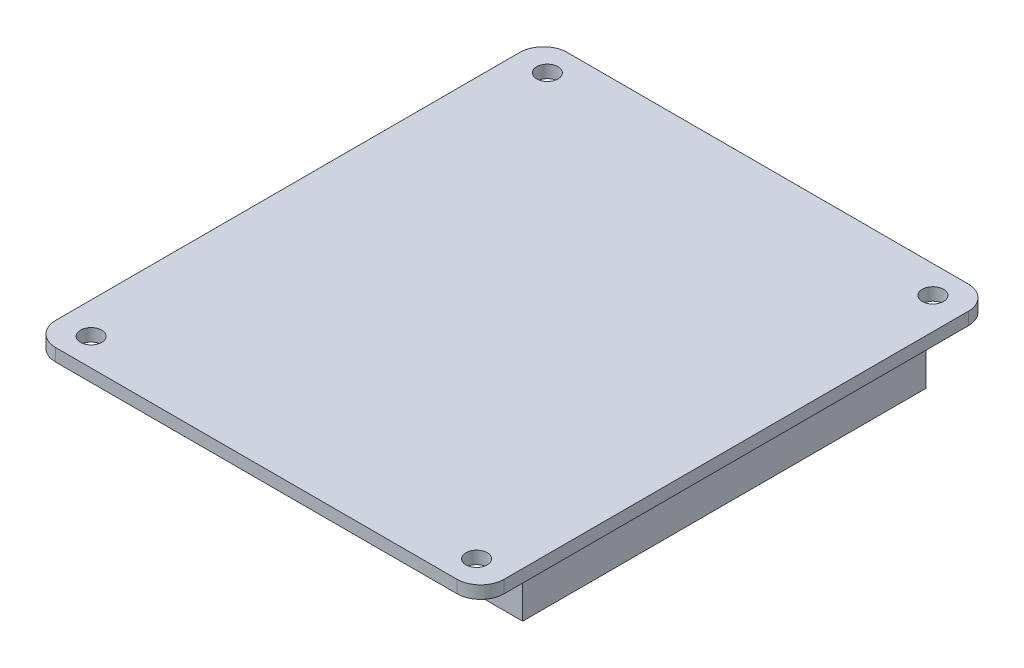
ISO-10303-21;
HEADER;
FILE_DESCRIPTION(('STEP AP214'),'2;1');
FILE_NAME('part.step','',(''),(''),'','','');
FILE_SCHEMA(('AUTOMOTIVE_DESIGN { 1 0 10303 214 1 1 1 1 }'));
ENDSEC;
DATA;
#1=APPLICATION_CONTEXT('core data for automotive mechanical design processes');
#2=APPLICATION_PROTOCOL_DEFINITION('international standard','automotive_design',2000,#1);
#3=PRODUCT_CONTEXT('',#1,'mechanical');
#4=PRODUCT('Part','Part','',(#3));
#5=PRODUCT_RELATED_PRODUCT_CATEGORY('part','',(#4));
#6=PRODUCT_DEFINITION_FORMATION('','',#4);
#7=PRODUCT_DEFINITION_CONTEXT('part definition',#1,'design');
#8=PRODUCT_DEFINITION('design','',#6,#7);
#9=PRODUCT_DEFINITION_SHAPE('','',#8);
#10=(LENGTH_UNIT() NAMED_UNIT(*) SI_UNIT(.MILLI.,.METRE.));
#11=(NAMED_UNIT(*) PLANE_ANGLE_UNIT() SI_UNIT($,.RADIAN.));
#12=(NAMED_UNIT(*) SI_UNIT($,.STERADIAN.) SOLID_ANGLE_UNIT());
#13=UNCERTAINTY_MEASURE_WITH_UNIT(LENGTH_MEASURE(1.E-05),#10,'distance_accuracy_value','');
#14=(GEOMETRIC_REPRESENTATION_CONTEXT(3) GLOBAL_UNCERTAINTY_ASSIGNED_CONTEXT((#13)) GLOBAL_UNIT_ASSIGNED_CONTEXT((#10,
#11,#12)) REPRESENTATION_CONTEXT('',''));
#15=CARTESIAN_POINT('',(0.,0.,0.));
#16=DIRECTION('',(0.,0.,1.));
#17=DIRECTION('',(1.,0.,0.));
#18=AXIS2_PLACEMENT_3D('',#15,#16,#17);
#19=CARTESIAN_POINT('',(3.,1.6,-3.));
#20=DIRECTION('',(0.,-1.,0.));
#21=DIRECTION('',(0.,0.,-1.));
#22=AXIS2_PLACEMENT_3D('',#19,#20,#21);
#23=CYLINDRICAL_SURFACE('',#22,3.);
#24=CARTESIAN_POINT('',(3.,0.,-3.));
#25=DIRECTION('',(0.,1.,0.));
#26=DIRECTION('',(0.,0.,-1.));
#27=AXIS2_PLACEMENT_3D('',#24,#25,#26);
#28=CIRCLE('',#27,3.);
#29=CARTESIAN_POINT('',(0.,0.,-3.00000000000002));
#30=VERTEX_POINT('',#29);
#31=CARTESIAN_POINT('',(3.00000000000002,0.,0.));
#32=VERTEX_POINT('',#31);
#33=EDGE_CURVE('E173',#30,#32,#28,.T.);
#34=ORIENTED_EDGE('',*,*,#33,.T.);
#35=DIRECTION('',(0.,-1.,0.));
#36=VECTOR('',#35,1.);
#37=CARTESIAN_POINT('',(3.00000000000002,1.6,0.));
#38=LINE('',#37,#36);
#39=CARTESIAN_POINT('',(3.00000000000002,1.6,0.));
#40=VERTEX_POINT('',#39);
#41=EDGE_CURVE('E11',#40,#32,#38,.T.);
#42=ORIENTED_EDGE('',*,*,#41,.F.);
#43=CARTESIAN_POINT('',(3.,1.6,-3.));
#44=DIRECTION('',(0.,1.,0.));
#45=DIRECTION('',(0.,0.,-1.));
#46=AXIS2_PLACEMENT_3D('',#43,#44,#45);
#47=CIRCLE('',#46,3.);
#48=CARTESIAN_POINT('',(0.,1.6,-3.00000000000002));
#49=VERTEX_POINT('',#48);
#50=EDGE_CURVE('E177',#49,#40,#47,.T.);
#51=ORIENTED_EDGE('',*,*,#50,.F.);
#52=DIRECTION('',(0.,-1.,0.));
#53=VECTOR('',#52,1.);
#54=CARTESIAN_POINT('',(0.,1.6,-3.00000000000002));
#55=LINE('',#54,#53);
#56=EDGE_CURVE('E198',#49,#30,#55,.T.);
#57=ORIENTED_EDGE('',*,*,#56,.T.);
#58=EDGE_LOOP('',(#34,#42,#51,#57));
#59=FACE_BOUND('',#58,.T.);
#60=ADVANCED_FACE('F37',(#59),#23,.T.);
#61=CARTESIAN_POINT('',(3.00000000000002,1.6,0.));
#62=DIRECTION('',(0.,0.,-1.));
#63=DIRECTION('',(-1.,0.,0.));
#64=AXIS2_PLACEMENT_3D('',#61,#62,#63);
#65=PLANE('',#64);
#66=DIRECTION('',(1.,0.,0.));
#67=VECTOR('',#66,1.);
#68=CARTESIAN_POINT('',(3.00000000000002,0.,0.));
#69=LINE('',#68,#67);
#70=CARTESIAN_POINT('',(54.,0.,0.));
#71=VERTEX_POINT('',#70);
#72=EDGE_CURVE('E200',#32,#71,#69,.T.);
#73=ORIENTED_EDGE('',*,*,#72,.T.);
#74=DIRECTION('',(0.,-1.,0.));
#75=VECTOR('',#74,1.);
#76=CARTESIAN_POINT('',(54.,1.6,0.));
#77=LINE('',#76,#75);
#78=CARTESIAN_POINT('',(54.,1.6,0.));
#79=VERTEX_POINT('',#78);
#80=EDGE_CURVE('E50',#79,#71,#77,.T.);
#81=ORIENTED_EDGE('',*,*,#80,.F.);
#82=DIRECTION('',(1.,0.,0.));
#83=VECTOR('',#82,1.);
#84=CARTESIAN_POINT('',(3.00000000000002,1.6,0.));
#85=LINE('',#84,#83);
#86=EDGE_CURVE('E182',#40,#79,#85,.T.);
#87=ORIENTED_EDGE('',*,*,#86,.F.);
#88=ORIENTED_EDGE('',*,*,#41,.T.);
#89=EDGE_LOOP('',(#73,#81,#87,#88));
#90=FACE_BOUND('',#89,.T.);
#91=ADVANCED_FACE('F258',(#90),#65,.F.);
#92=CARTESIAN_POINT('',(54.,1.6,-3.));
#93=DIRECTION('',(0.,-1.,0.));
#94=DIRECTION('',(0.,0.,-1.));
#95=AXIS2_PLACEMENT_3D('',#92,#93,#94);
#96=CYLINDRICAL_SURFACE('',#95,3.);
#97=CARTESIAN_POINT('',(54.,0.,-3.));
#98=DIRECTION('',(0.,1.,0.));
#99=DIRECTION('',(0.,0.,1.));
#100=AXIS2_PLACEMENT_3D('',#97,#98,#99);
#101=CIRCLE('',#100,3.);
#102=CARTESIAN_POINT('',(57.,0.,-3.00000000000002));
#103=VERTEX_POINT('',#102);
#104=EDGE_CURVE('E203',#71,#103,#101,.T.);
#105=ORIENTED_EDGE('',*,*,#104,.T.);
#106=DIRECTION('',(0.,-1.,0.));
#107=VECTOR('',#106,1.);
#108=CARTESIAN_POINT('',(57.,1.6,-3.00000000000002));
#109=LINE('',#108,#107);
#110=CARTESIAN_POINT('',(57.,1.6,-3.00000000000002));
#111=VERTEX_POINT('',#110);
#112=EDGE_CURVE('E227',#111,#103,#109,.T.);
#113=ORIENTED_EDGE('',*,*,#112,.F.);
#114=CARTESIAN_POINT('',(54.,1.6,-3.));
#115=DIRECTION('',(0.,1.,0.));
#116=DIRECTION('',(0.,0.,1.));
#117=AXIS2_PLACEMENT_3D('',#114,#115,#116);
#118=CIRCLE('',#117,3.);
#119=EDGE_CURVE('E184',#79,#111,#118,.T.);
#120=ORIENTED_EDGE('',*,*,#119,.F.);
#121=ORIENTED_EDGE('',*,*,#80,.T.);
#122=EDGE_LOOP('',(#105,#113,#120,#121));
#123=FACE_BOUND('',#122,.T.);
#124=ADVANCED_FACE('F232',(#123),#96,.T.);
#125=CARTESIAN_POINT('',(57.,1.6,-3.00000000000002));
#126=DIRECTION('',(-1.,0.,0.));
#127=DIRECTION('',(0.,0.,1.));
#128=AXIS2_PLACEMENT_3D('',#125,#126,#127);
#129=PLANE('',#128);
#130=DIRECTION('',(0.,0.,-1.));
#131=VECTOR('',#130,1.);
#132=CARTESIAN_POINT('',(57.,0.,-3.00000000000002));
#133=LINE('',#132,#131);
#134=CARTESIAN_POINT('',(57.,0.,-62.));
#135=VERTEX_POINT('',#134);
#136=EDGE_CURVE('E201',#103,#135,#133,.T.);
#137=ORIENTED_EDGE('',*,*,#136,.T.);
#138=DIRECTION('',(0.,-1.,0.));
#139=VECTOR('',#138,1.);
#140=CARTESIAN_POINT('',(57.,1.6,-62.));
#141=LINE('',#140,#139);
#142=CARTESIAN_POINT('',(57.,1.6,-62.));
#143=VERTEX_POINT('',#142);
#144=EDGE_CURVE('E224',#143,#135,#141,.T.);
#145=ORIENTED_EDGE('',*,*,#144,.F.);
#146=DIRECTION('',(0.,0.,-1.));
#147=VECTOR('',#146,1.);
#148=CARTESIAN_POINT('',(57.,1.6,-3.00000000000002));
#149=LINE('',#148,#147);
#150=EDGE_CURVE('E187',#111,#143,#149,.T.);
#151=ORIENTED_EDGE('',*,*,#150,.F.);
#152=ORIENTED_EDGE('',*,*,#112,.T.);
#153=EDGE_LOOP('',(#137,#145,#151,#152));
#154=FACE_BOUND('',#153,.T.);
#155=ADVANCED_FACE('F241',(#154),#129,.F.);
#156=CARTESIAN_POINT('',(54.,1.6,-62.));
#157=DIRECTION('',(0.,-1.,0.));
#158=DIRECTION('',(0.,0.,-1.));
#159=AXIS2_PLACEMENT_3D('',#156,#157,#158);
#160=CYLINDRICAL_SURFACE('',#159,3.);
#161=CARTESIAN_POINT('',(54.,0.,-62.));
#162=DIRECTION('',(0.,1.,0.));
#163=DIRECTION('',(0.,0.,-1.));
#164=AXIS2_PLACEMENT_3D('',#161,#162,#163);
#165=CIRCLE('',#164,3.);
#166=CARTESIAN_POINT('',(54.,0.,-65.));
#167=VERTEX_POINT('',#166);
#168=EDGE_CURVE('E202',#135,#167,#165,.T.);
#169=ORIENTED_EDGE('',*,*,#168,.T.);
#170=DIRECTION('',(0.,-1.,0.));
#171=VECTOR('',#170,1.);
#172=CARTESIAN_POINT('',(54.,1.6,-65.));
#173=LINE('',#172,#171);
#174=CARTESIAN_POINT('',(54.,1.6,-65.));
#175=VERTEX_POINT('',#174);
#176=EDGE_CURVE('E219',#175,#167,#173,.T.);
#177=ORIENTED_EDGE('',*,*,#176,.F.);
#178=CARTESIAN_POINT('',(54.,1.6,-62.));
#179=DIRECTION('',(0.,1.,0.));
#180=DIRECTION('',(0.,0.,-1.));
#181=AXIS2_PLACEMENT_3D('',#178,#179,#180);
#182=CIRCLE('',#181,3.);
#183=EDGE_CURVE('E189',#143,#175,#182,.T.);
#184=ORIENTED_EDGE('',*,*,#183,.F.);
#185=ORIENTED_EDGE('',*,*,#144,.T.);
#186=EDGE_LOOP('',(#169,#177,#184,#185));
#187=FACE_BOUND('',#186,.T.);
#188=ADVANCED_FACE('F250',(#187),#160,.T.);
#189=CARTESIAN_POINT('',(3.00000000000002,1.6,-65.));
#190=DIRECTION('',(0.,0.,1.));
#191=DIRECTION('',(1.,0.,0.));
#192=AXIS2_PLACEMENT_3D('',#189,#190,#191);
#193=PLANE('',#192);
#194=DIRECTION('',(-1.,0.,0.));
#195=VECTOR('',#194,1.);
#196=CARTESIAN_POINT('',(3.00000000000002,0.,-65.));
#197=LINE('',#196,#195);
#198=CARTESIAN_POINT('',(3.00000000000002,0.,-65.));
#199=VERTEX_POINT('',#198);
#200=EDGE_CURVE('E210',#167,#199,#197,.T.);
#201=ORIENTED_EDGE('',*,*,#200,.T.);
#202=DIRECTION('',(0.,-1.,0.));
#203=VECTOR('',#202,1.);
#204=CARTESIAN_POINT('',(3.00000000000002,1.6,-65.));
#205=LINE('',#204,#203);
#206=CARTESIAN_POINT('',(3.00000000000002,1.6,-65.));
#207=VERTEX_POINT('',#206);
#208=EDGE_CURVE('E220',#207,#199,#205,.T.);
#209=ORIENTED_EDGE('',*,*,#208,.F.);
#210=DIRECTION('',(-1.,0.,0.));
#211=VECTOR('',#210,1.);
#212=CARTESIAN_POINT('',(3.00000000000002,1.6,-65.));
#213=LINE('',#212,#211);
#214=EDGE_CURVE('E188',#175,#207,#213,.T.);
#215=ORIENTED_EDGE('',*,*,#214,.F.);
#216=ORIENTED_EDGE('',*,*,#176,.T.);
#217=EDGE_LOOP('',(#201,#209,#215,#216));
#218=FACE_BOUND('',#217,.T.);
#219=ADVANCED_FACE('F267',(#218),#193,.F.);
#220=CARTESIAN_POINT('',(3.,1.6,-62.));
#221=DIRECTION('',(0.,-1.,0.));
#222=DIRECTION('',(0.,0.,-1.));
#223=AXIS2_PLACEMENT_3D('',#220,#221,#222);
#224=CYLINDRICAL_SURFACE('',#223,3.);
#225=CARTESIAN_POINT('',(3.,0.,-62.));
#226=DIRECTION('',(0.,1.,0.));
#227=DIRECTION('',(0.,0.,-1.));
#228=AXIS2_PLACEMENT_3D('',#225,#226,#227);
#229=CIRCLE('',#228,3.);
#230=CARTESIAN_POINT('',(0.,0.,-62.));
#231=VERTEX_POINT('',#230);
#232=EDGE_CURVE('E207',#199,#231,#229,.T.);
#233=ORIENTED_EDGE('',*,*,#232,.T.);
#234=DIRECTION('',(0.,-1.,0.));
#235=VECTOR('',#234,1.);
#236=CARTESIAN_POINT('',(0.,1.6,-62.));
#237=LINE('',#236,#235);
#238=CARTESIAN_POINT('',(0.,1.6,-62.));
#239=VERTEX_POINT('',#238);
#240=EDGE_CURVE('E212',#239,#231,#237,.T.);
#241=ORIENTED_EDGE('',*,*,#240,.F.);
#242=CARTESIAN_POINT('',(3.,1.6,-62.));
#243=DIRECTION('',(0.,1.,0.));
#244=DIRECTION('',(0.,0.,-1.));
#245=AXIS2_PLACEMENT_3D('',#242,#243,#244);
#246=CIRCLE('',#245,3.);
#247=EDGE_CURVE('E191',#207,#239,#246,.T.);
#248=ORIENTED_EDGE('',*,*,#247,.F.);
#249=ORIENTED_EDGE('',*,*,#208,.T.);
#250=EDGE_LOOP('',(#233,#241,#248,#249));
#251=FACE_BOUND('',#250,.T.);
#252=ADVANCED_FACE('F270',(#251),#224,.T.);
#253=CARTESIAN_POINT('',(0.,1.6,-3.00000000000002));
#254=DIRECTION('',(1.,0.,0.));
#255=DIRECTION('',(0.,0.,-1.));
#256=AXIS2_PLACEMENT_3D('',#253,#254,#255);
#257=PLANE('',#256);
#258=DIRECTION('',(0.,0.,1.));
#259=VECTOR('',#258,1.);
#260=CARTESIAN_POINT('',(0.,0.,-3.00000000000002));
#261=LINE('',#260,#259);
#262=EDGE_CURVE('E185',#231,#30,#261,.T.);
#263=ORIENTED_EDGE('',*,*,#262,.T.);
#264=ORIENTED_EDGE('',*,*,#56,.F.);
#265=DIRECTION('',(0.,0.,1.));
#266=VECTOR('',#265,1.);
#267=CARTESIAN_POINT('',(0.,1.6,-3.00000000000002));
#268=LINE('',#267,#266);
#269=EDGE_CURVE('E193',#239,#49,#268,.T.);
#270=ORIENTED_EDGE('',*,*,#269,.F.);
#271=ORIENTED_EDGE('',*,*,#240,.T.);
#272=EDGE_LOOP('',(#263,#264,#270,#271));
#273=FACE_BOUND('',#272,.T.);
#274=ADVANCED_FACE('F265',(#273),#257,.F.);
#275=CARTESIAN_POINT('',(3.,1.6,-3.));
#276=DIRECTION('',(0.,-1.,0.));
#277=DIRECTION('',(0.,0.,-1.));
#278=AXIS2_PLACEMENT_3D('',#275,#276,#277);
#279=PLANE('',#278);
#280=CARTESIAN_POINT('',(4.00000000000001,1.6,-3.49999999999999));
#281=DIRECTION('',(0.,1.,0.));
#282=DIRECTION('',(0.,0.,1.));
#283=AXIS2_PLACEMENT_3D('',#280,#281,#282);
#284=CIRCLE('',#283,1.35);
#285=CARTESIAN_POINT('',(4.00000000000001,1.6,-2.14999999999999));
#286=VERTEX_POINT('',#285);
#287=EDGE_CURVE('E151',#286,#286,#284,.T.);
#288=ORIENTED_EDGE('',*,*,#287,.F.);
#289=EDGE_LOOP('',(#288));
#290=FACE_BOUND('',#289,.T.);
#291=CARTESIAN_POINT('',(53.,1.6,-3.49999999999999));
#292=DIRECTION('',(0.,1.,0.));
#293=DIRECTION('',(0.,0.,1.));
#294=AXIS2_PLACEMENT_3D('',#291,#292,#293);
#295=CIRCLE('',#294,1.35);
#296=CARTESIAN_POINT('',(53.,1.6,-2.14999999999999));
#297=VERTEX_POINT('',#296);
#298=EDGE_CURVE('E163',#297,#297,#295,.T.);
#299=ORIENTED_EDGE('',*,*,#298,.F.);
#300=EDGE_LOOP('',(#299));
#301=FACE_BOUND('',#300,.T.);
#302=CARTESIAN_POINT('',(53.,1.6,-61.5));
#303=DIRECTION('',(0.,1.,0.));
#304=DIRECTION('',(0.,0.,1.));
#305=AXIS2_PLACEMENT_3D('',#302,#303,#304);
#306=CIRCLE('',#305,1.35);
#307=CARTESIAN_POINT('',(53.,1.6,-60.15));
#308=VERTEX_POINT('',#307);
#309=EDGE_CURVE('E160',#308,#308,#306,.T.);
#310=ORIENTED_EDGE('',*,*,#309,.F.);
#311=EDGE_LOOP('',(#310));
#312=FACE_BOUND('',#311,.T.);
#313=CARTESIAN_POINT('',(4.,1.6,-61.5));
#314=DIRECTION('',(0.,1.,0.));
#315=DIRECTION('',(0.,0.,1.));
#316=AXIS2_PLACEMENT_3D('',#313,#314,#315);
#317=CIRCLE('',#316,1.35);
#318=CARTESIAN_POINT('',(4.,1.6,-60.15));
#319=VERTEX_POINT('',#318);
#320=EDGE_CURVE('E159',#319,#319,#317,.T.);
#321=ORIENTED_EDGE('',*,*,#320,.F.);
#322=EDGE_LOOP('',(#321));
#323=FACE_BOUND('',#322,.T.);
#324=ORIENTED_EDGE('',*,*,#50,.T.);
#325=ORIENTED_EDGE('',*,*,#86,.T.);
#326=ORIENTED_EDGE('',*,*,#119,.T.);
#327=ORIENTED_EDGE('',*,*,#150,.T.);
#328=ORIENTED_EDGE('',*,*,#183,.T.);
#329=ORIENTED_EDGE('',*,*,#214,.T.);
#330=ORIENTED_EDGE('',*,*,#247,.T.);
#331=ORIENTED_EDGE('',*,*,#269,.T.);
#332=EDGE_LOOP('',(#324,#325,#326,#327,#328,#329,#330,#331));
#333=FACE_BOUND('',#332,.T.);
#334=ADVANCED_FACE('F252',(#290,#301,#312,#323,#333),#279,.F.);
#335=CARTESIAN_POINT('',(3.,0.,-3.));
#336=DIRECTION('',(0.,-1.,0.));
#337=DIRECTION('',(0.,0.,-1.));
#338=AXIS2_PLACEMENT_3D('',#335,#336,#337);
#339=PLANE('',#338);
#340=DIRECTION('',(0.,0.,-1.));
#341=VECTOR('',#340,1.);
#342=CARTESIAN_POINT('',(50.5,0.,-58.15));
#343=LINE('',#342,#341);
#344=CARTESIAN_POINT('',(50.5,0.,-6.85));
#345=VERTEX_POINT('',#344);
#346=CARTESIAN_POINT('',(50.5,0.,-58.15));
#347=VERTEX_POINT('',#346);
#348=EDGE_CURVE('E53',#345,#347,#343,.T.);
#349=ORIENTED_EDGE('',*,*,#348,.F.);
#350=DIRECTION('',(-1.,0.,0.));
#351=VECTOR('',#350,1.);
#352=CARTESIAN_POINT('',(50.5,0.,-6.85));
#353=LINE('',#352,#351);
#354=CARTESIAN_POINT('',(55.5,0.,-6.85));
#355=VERTEX_POINT('',#354);
#356=EDGE_CURVE('E59',#355,#345,#353,.T.);
#357=ORIENTED_EDGE('',*,*,#356,.F.);
#358=DIRECTION('',(0.,0.,1.));
#359=VECTOR('',#358,1.);
#360=CARTESIAN_POINT('',(55.5,0.,-58.15));
#361=LINE('',#360,#359);
#362=CARTESIAN_POINT('',(55.5,0.,-58.15));
#363=VERTEX_POINT('',#362);
#364=EDGE_CURVE('E421',#363,#355,#361,.T.);
#365=ORIENTED_EDGE('',*,*,#364,.F.);
#366=DIRECTION('',(1.,0.,0.));
#367=VECTOR('',#366,1.);
#368=CARTESIAN_POINT('',(50.5,0.,-58.15));
#369=LINE('',#368,#367);
#370=EDGE_CURVE('E427',#347,#363,#369,.T.);
#371=ORIENTED_EDGE('',*,*,#370,.F.);
#372=EDGE_LOOP('',(#349,#357,#365,#371));
#373=FACE_BOUND('',#372,.T.);
#374=CARTESIAN_POINT('',(4.00000000000001,0.,-3.49999999999999));
#375=DIRECTION('',(0.,1.,0.));
#376=DIRECTION('',(0.,0.,1.));
#377=AXIS2_PLACEMENT_3D('',#374,#375,#376);
#378=CIRCLE('',#377,1.35);
#379=CARTESIAN_POINT('',(4.00000000000001,0.,-2.14999999999999));
#380=VERTEX_POINT('',#379);
#381=EDGE_CURVE('E146',#380,#380,#378,.T.);
#382=ORIENTED_EDGE('',*,*,#381,.T.);
#383=EDGE_LOOP('',(#382));
#384=FACE_BOUND('',#383,.T.);
#385=CARTESIAN_POINT('',(53.,0.,-3.49999999999999));
#386=DIRECTION('',(0.,1.,0.));
#387=DIRECTION('',(0.,0.,1.));
#388=AXIS2_PLACEMENT_3D('',#385,#386,#387);
#389=CIRCLE('',#388,1.35);
#390=CARTESIAN_POINT('',(53.,0.,-2.14999999999999));
#391=VERTEX_POINT('',#390);
#392=EDGE_CURVE('E170',#391,#391,#389,.T.);
#393=ORIENTED_EDGE('',*,*,#392,.T.);
#394=EDGE_LOOP('',(#393));
#395=FACE_BOUND('',#394,.T.);
#396=CARTESIAN_POINT('',(53.,0.,-61.5));
#397=DIRECTION('',(0.,1.,0.));
#398=DIRECTION('',(0.,0.,1.));
#399=AXIS2_PLACEMENT_3D('',#396,#397,#398);
#400=CIRCLE('',#399,1.35);
#401=CARTESIAN_POINT('',(53.,0.,-60.15));
#402=VERTEX_POINT('',#401);
#403=EDGE_CURVE('E161',#402,#402,#400,.T.);
#404=ORIENTED_EDGE('',*,*,#403,.T.);
#405=EDGE_LOOP('',(#404));
#406=FACE_BOUND('',#405,.T.);
#407=CARTESIAN_POINT('',(4.,0.,-61.5));
#408=DIRECTION('',(0.,1.,0.));
#409=DIRECTION('',(0.,0.,1.));
#410=AXIS2_PLACEMENT_3D('',#407,#408,#409);
#411=CIRCLE('',#410,1.35);
#412=CARTESIAN_POINT('',(4.,0.,-60.15));
#413=VERTEX_POINT('',#412);
#414=EDGE_CURVE('E175',#413,#413,#411,.T.);
#415=ORIENTED_EDGE('',*,*,#414,.T.);
#416=EDGE_LOOP('',(#415));
#417=FACE_BOUND('',#416,.T.);
#418=ORIENTED_EDGE('',*,*,#33,.F.);
#419=ORIENTED_EDGE('',*,*,#262,.F.);
#420=ORIENTED_EDGE('',*,*,#232,.F.);
#421=ORIENTED_EDGE('',*,*,#200,.F.);
#422=ORIENTED_EDGE('',*,*,#168,.F.);
#423=ORIENTED_EDGE('',*,*,#136,.F.);
#424=ORIENTED_EDGE('',*,*,#104,.F.);
#425=ORIENTED_EDGE('',*,*,#72,.F.);
#426=EDGE_LOOP('',(#418,#419,#420,#421,#422,#423,#424,#425));
#427=FACE_BOUND('',#426,.T.);
#428=ADVANCED_FACE('F239',(#373,#384,#395,#406,#417,#427),#339,.T.);
#429=CARTESIAN_POINT('',(4.,0.,-61.5));
#430=DIRECTION('',(0.,1.,0.));
#431=DIRECTION('',(0.,0.,1.));
#432=AXIS2_PLACEMENT_3D('',#429,#430,#431);
#433=CYLINDRICAL_SURFACE('',#432,1.35);
#434=ORIENTED_EDGE('',*,*,#414,.F.);
#435=EDGE_LOOP('',(#434));
#436=FACE_BOUND('',#435,.T.);
#437=ORIENTED_EDGE('',*,*,#320,.T.);
#438=EDGE_LOOP('',(#437));
#439=FACE_BOUND('',#438,.T.);
#440=ADVANCED_FACE('F333',(#436,#439),#433,.F.);
#441=CARTESIAN_POINT('',(53.,0.,-61.5));
#442=DIRECTION('',(0.,1.,0.));
#443=DIRECTION('',(0.,0.,1.));
#444=AXIS2_PLACEMENT_3D('',#441,#442,#443);
#445=CYLINDRICAL_SURFACE('',#444,1.35);
#446=ORIENTED_EDGE('',*,*,#403,.F.);
#447=EDGE_LOOP('',(#446));
#448=FACE_BOUND('',#447,.T.);
#449=ORIENTED_EDGE('',*,*,#309,.T.);
#450=EDGE_LOOP('',(#449));
#451=FACE_BOUND('',#450,.T.);
#452=ADVANCED_FACE('F344',(#448,#451),#445,.F.);
#453=CARTESIAN_POINT('',(53.,0.,-3.49999999999999));
#454=DIRECTION('',(0.,1.,0.));
#455=DIRECTION('',(0.,0.,1.));
#456=AXIS2_PLACEMENT_3D('',#453,#454,#455);
#457=CYLINDRICAL_SURFACE('',#456,1.35);
#458=ORIENTED_EDGE('',*,*,#392,.F.);
#459=EDGE_LOOP('',(#458));
#460=FACE_BOUND('',#459,.T.);
#461=ORIENTED_EDGE('',*,*,#298,.T.);
#462=EDGE_LOOP('',(#461));
#463=FACE_BOUND('',#462,.T.);
#464=ADVANCED_FACE('F353',(#460,#463),#457,.F.);
#465=CARTESIAN_POINT('',(4.00000000000001,0.,-3.49999999999999));
#466=DIRECTION('',(0.,1.,0.));
#467=DIRECTION('',(0.,0.,1.));
#468=AXIS2_PLACEMENT_3D('',#465,#466,#467);
#469=CYLINDRICAL_SURFACE('',#468,1.35);
#470=ORIENTED_EDGE('',*,*,#381,.F.);
#471=EDGE_LOOP('',(#470));
#472=FACE_BOUND('',#471,.T.);
#473=ORIENTED_EDGE('',*,*,#287,.T.);
#474=EDGE_LOOP('',(#473));
#475=FACE_BOUND('',#474,.T.);
#476=ADVANCED_FACE('F364',(#472,#475),#469,.F.);
#477=CARTESIAN_POINT('',(50.5,-5.7,-58.15));
#478=DIRECTION('',(1.,0.,0.));
#479=DIRECTION('',(0.,0.,-1.));
#480=AXIS2_PLACEMENT_3D('',#477,#478,#479);
#481=PLANE('',#480);
#482=ORIENTED_EDGE('',*,*,#348,.T.);
#483=DIRECTION('',(0.,1.,0.));
#484=VECTOR('',#483,1.);
#485=CARTESIAN_POINT('',(50.5,-5.7,-58.15));
#486=LINE('',#485,#484);
#487=CARTESIAN_POINT('',(50.5,-5.7,-58.15));
#488=VERTEX_POINT('',#487);
#489=EDGE_CURVE('E132',#488,#347,#486,.T.);
#490=ORIENTED_EDGE('',*,*,#489,.F.);
#491=DIRECTION('',(0.,0.,-1.));
#492=VECTOR('',#491,1.);
#493=CARTESIAN_POINT('',(50.5,-5.7,-58.15));
#494=LINE('',#493,#492);
#495=CARTESIAN_POINT('',(50.5,-5.7,-6.85));
#496=VERTEX_POINT('',#495);
#497=EDGE_CURVE('E136',#496,#488,#494,.T.);
#498=ORIENTED_EDGE('',*,*,#497,.F.);
#499=DIRECTION('',(0.,1.,0.));
#500=VECTOR('',#499,1.);
#501=CARTESIAN_POINT('',(50.5,-5.7,-6.85));
#502=LINE('',#501,#500);
#503=EDGE_CURVE('E423',#496,#345,#502,.T.);
#504=ORIENTED_EDGE('',*,*,#503,.T.);
#505=EDGE_LOOP('',(#482,#490,#498,#504));
#506=FACE_BOUND('',#505,.T.);
#507=ADVANCED_FACE('F150',(#506),#481,.F.);
#508=CARTESIAN_POINT('',(50.5,-5.7,-58.15));
#509=DIRECTION('',(0.,0.,1.));
#510=DIRECTION('',(1.,0.,0.));
#511=AXIS2_PLACEMENT_3D('',#508,#509,#510);
#512=PLANE('',#511);
#513=ORIENTED_EDGE('',*,*,#370,.T.);
#514=DIRECTION('',(0.,1.,0.));
#515=VECTOR('',#514,1.);
#516=CARTESIAN_POINT('',(55.5,-5.7,-58.15));
#517=LINE('',#516,#515);
#518=CARTESIAN_POINT('',(55.5,-5.7,-58.15));
#519=VERTEX_POINT('',#518);
#520=EDGE_CURVE('E134',#519,#363,#517,.T.);
#521=ORIENTED_EDGE('',*,*,#520,.F.);
#522=DIRECTION('',(1.,0.,0.));
#523=VECTOR('',#522,1.);
#524=CARTESIAN_POINT('',(50.5,-5.7,-58.15));
#525=LINE('',#524,#523);
#526=EDGE_CURVE('E127',#488,#519,#525,.T.);
#527=ORIENTED_EDGE('',*,*,#526,.F.);
#528=ORIENTED_EDGE('',*,*,#489,.T.);
#529=EDGE_LOOP('',(#513,#521,#527,#528));
#530=FACE_BOUND('',#529,.T.);
#531=ADVANCED_FACE('F129',(#530),#512,.F.);
#532=CARTESIAN_POINT('',(55.5,-5.7,-58.15));
#533=DIRECTION('',(-1.,0.,0.));
#534=DIRECTION('',(0.,0.,1.));
#535=AXIS2_PLACEMENT_3D('',#532,#533,#534);
#536=PLANE('',#535);
#537=ORIENTED_EDGE('',*,*,#364,.T.);
#538=DIRECTION('',(0.,1.,0.));
#539=VECTOR('',#538,1.);
#540=CARTESIAN_POINT('',(55.5,-5.7,-6.85));
#541=LINE('',#540,#539);
#542=CARTESIAN_POINT('',(55.5,-5.7,-6.85));
#543=VERTEX_POINT('',#542);
#544=EDGE_CURVE('E153',#543,#355,#541,.T.);
#545=ORIENTED_EDGE('',*,*,#544,.F.);
#546=DIRECTION('',(0.,0.,1.));
#547=VECTOR('',#546,1.);
#548=CARTESIAN_POINT('',(55.5,-5.7,-58.15));
#549=LINE('',#548,#547);
#550=EDGE_CURVE('E139',#519,#543,#549,.T.);
#551=ORIENTED_EDGE('',*,*,#550,.F.);
#552=ORIENTED_EDGE('',*,*,#520,.T.);
#553=EDGE_LOOP('',(#537,#545,#551,#552));
#554=FACE_BOUND('',#553,.T.);
#555=ADVANCED_FACE('F388',(#554),#536,.F.);
#556=CARTESIAN_POINT('',(50.5,-5.7,-6.85));
#557=DIRECTION('',(0.,0.,-1.));
#558=DIRECTION('',(-1.,0.,0.));
#559=AXIS2_PLACEMENT_3D('',#556,#557,#558);
#560=PLANE('',#559);
#561=ORIENTED_EDGE('',*,*,#356,.T.);
#562=ORIENTED_EDGE('',*,*,#503,.F.);
#563=DIRECTION('',(-1.,0.,0.));
#564=VECTOR('',#563,1.);
#565=CARTESIAN_POINT('',(50.5,-5.7,-6.85));
#566=LINE('',#565,#564);
#567=EDGE_CURVE('E142',#543,#496,#566,.T.);
#568=ORIENTED_EDGE('',*,*,#567,.F.);
#569=ORIENTED_EDGE('',*,*,#544,.T.);
#570=EDGE_LOOP('',(#561,#562,#568,#569));
#571=FACE_BOUND('',#570,.T.);
#572=ADVANCED_FACE('F398',(#571),#560,.F.);
#573=CARTESIAN_POINT('',(0.,-5.7,0.));
#574=DIRECTION('',(0.,1.,0.));
#575=DIRECTION('',(0.,0.,1.));
#576=AXIS2_PLACEMENT_3D('',#573,#574,#575);
#577=PLANE('',#576);
#578=ORIENTED_EDGE('',*,*,#497,.T.);
#579=ORIENTED_EDGE('',*,*,#526,.T.);
#580=ORIENTED_EDGE('',*,*,#550,.T.);
#581=ORIENTED_EDGE('',*,*,#567,.T.);
#582=EDGE_LOOP('',(#578,#579,#580,#581));
#583=FACE_BOUND('',#582,.T.);
#584=ADVANCED_FACE('F137',(#583),#577,.F.);
#585=CLOSED_SHELL('',(#60,#91,#124,#155,#188,#219,#252,#274,#334,#428,#440,#452,#464,#476,#507,
#531,#555,#572,#584));
#586=MANIFOLD_SOLID_BREP('B2',#585);
#587=ADVANCED_BREP_SHAPE_REPRESENTATION('',(#18,#586),#14);
#588=SHAPE_DEFINITION_REPRESENTATION(#9,#587);
ENDSEC;
END-ISO-10303-21;
